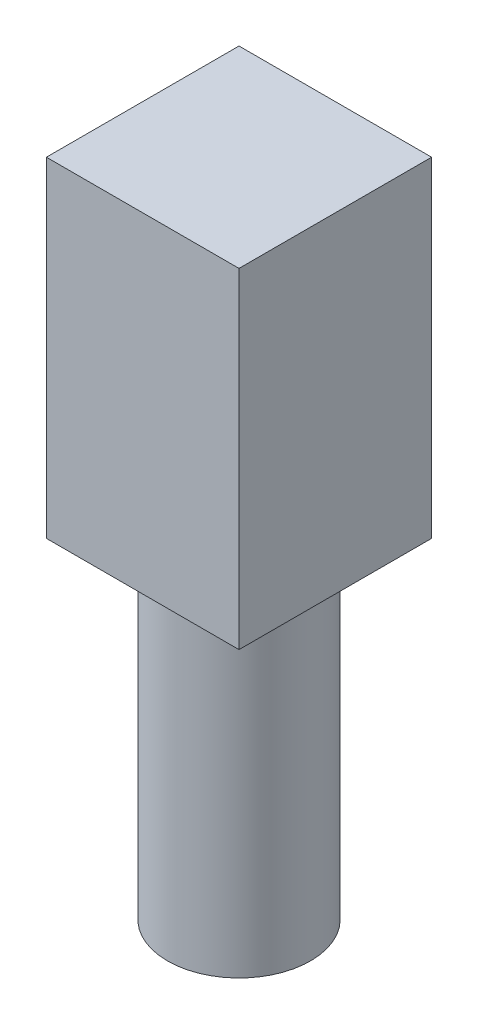
ISO-10303-21;
HEADER;
FILE_DESCRIPTION(('STEP AP214'),'2;1');
FILE_NAME('part.step','',(''),(''),'','','');
FILE_SCHEMA(('AUTOMOTIVE_DESIGN { 1 0 10303 214 1 1 1 1 }'));
ENDSEC;
DATA;
#1=APPLICATION_CONTEXT('core data for automotive mechanical design processes');
#2=APPLICATION_PROTOCOL_DEFINITION('international standard','automotive_design',2000,#1);
#3=PRODUCT_CONTEXT('',#1,'mechanical');
#4=PRODUCT('Part','Part','',(#3));
#5=PRODUCT_RELATED_PRODUCT_CATEGORY('part','',(#4));
#6=PRODUCT_DEFINITION_FORMATION('','',#4);
#7=PRODUCT_DEFINITION_CONTEXT('part definition',#1,'design');
#8=PRODUCT_DEFINITION('design','',#6,#7);
#9=PRODUCT_DEFINITION_SHAPE('','',#8);
#10=(LENGTH_UNIT() NAMED_UNIT(*) SI_UNIT(.MILLI.,.METRE.));
#11=(NAMED_UNIT(*) PLANE_ANGLE_UNIT() SI_UNIT($,.RADIAN.));
#12=(NAMED_UNIT(*) SI_UNIT($,.STERADIAN.) SOLID_ANGLE_UNIT());
#13=UNCERTAINTY_MEASURE_WITH_UNIT(LENGTH_MEASURE(1.E-05),#10,'distance_accuracy_value','');
#14=(GEOMETRIC_REPRESENTATION_CONTEXT(3) GLOBAL_UNCERTAINTY_ASSIGNED_CONTEXT((#13)) GLOBAL_UNIT_ASSIGNED_CONTEXT((#10,
#11,#12)) REPRESENTATION_CONTEXT('',''));
#15=CARTESIAN_POINT('',(0.,0.,0.));
#16=DIRECTION('',(0.,0.,1.));
#17=DIRECTION('',(1.,0.,0.));
#18=AXIS2_PLACEMENT_3D('',#15,#16,#17);
#19=CARTESIAN_POINT('',(0.,6.,0.));
#20=DIRECTION('',(0.,-1.,0.));
#21=DIRECTION('',(0.,0.,-1.));
#22=AXIS2_PLACEMENT_3D('',#19,#20,#21);
#23=CYLINDRICAL_SURFACE('',#22,1.3);
#24=CARTESIAN_POINT('',(0.,6.,0.));
#25=DIRECTION('',(0.,1.,0.));
#26=DIRECTION('',(0.,0.,1.));
#27=AXIS2_PLACEMENT_3D('',#24,#25,#26);
#28=CIRCLE('',#27,1.3);
#29=CARTESIAN_POINT('',(0.,6.,1.3));
#30=VERTEX_POINT('',#29);
#31=EDGE_CURVE('E11',#30,#30,#28,.T.);
#32=ORIENTED_EDGE('',*,*,#31,.F.);
#33=EDGE_LOOP('',(#32));
#34=FACE_BOUND('',#33,.T.);
#35=CARTESIAN_POINT('',(0.,0.,0.));
#36=DIRECTION('',(0.,1.,0.));
#37=DIRECTION('',(0.,0.,1.));
#38=AXIS2_PLACEMENT_3D('',#35,#36,#37);
#39=CIRCLE('',#38,1.3);
#40=CARTESIAN_POINT('',(0.,0.,1.3));
#41=VERTEX_POINT('',#40);
#42=EDGE_CURVE('E36',#41,#41,#39,.T.);
#43=ORIENTED_EDGE('',*,*,#42,.T.);
#44=EDGE_LOOP('',(#43));
#45=FACE_BOUND('',#44,.T.);
#46=ADVANCED_FACE('F33',(#34,#45),#23,.T.);
#47=CARTESIAN_POINT('',(0.,0.,0.));
#48=DIRECTION('',(0.,1.,0.));
#49=DIRECTION('',(0.,0.,1.));
#50=AXIS2_PLACEMENT_3D('',#47,#48,#49);
#51=PLANE('',#50);
#52=ORIENTED_EDGE('',*,*,#42,.F.);
#53=EDGE_LOOP('',(#52));
#54=FACE_BOUND('',#53,.T.);
#55=ADVANCED_FACE('F112',(#54),#51,.F.);
#56=CARTESIAN_POINT('',(-1.75,12.,-1.75));
#57=DIRECTION('',(1.,0.,0.));
#58=DIRECTION('',(0.,0.,-1.));
#59=AXIS2_PLACEMENT_3D('',#56,#57,#58);
#60=PLANE('',#59);
#61=DIRECTION('',(0.,0.,1.));
#62=VECTOR('',#61,1.);
#63=CARTESIAN_POINT('',(-1.75,6.,-1.75));
#64=LINE('',#63,#62);
#65=CARTESIAN_POINT('',(-1.75,6.,-1.75));
#66=VERTEX_POINT('',#65);
#67=CARTESIAN_POINT('',(-1.75,6.,1.75));
#68=VERTEX_POINT('',#67);
#69=EDGE_CURVE('E100',#66,#68,#64,.T.);
#70=ORIENTED_EDGE('',*,*,#69,.T.);
#71=DIRECTION('',(0.,-1.,0.));
#72=VECTOR('',#71,1.);
#73=CARTESIAN_POINT('',(-1.75,12.,1.75));
#74=LINE('',#73,#72);
#75=CARTESIAN_POINT('',(-1.75,12.,1.75));
#76=VERTEX_POINT('',#75);
#77=EDGE_CURVE('E91',#76,#68,#74,.T.);
#78=ORIENTED_EDGE('',*,*,#77,.F.);
#79=DIRECTION('',(0.,0.,1.));
#80=VECTOR('',#79,1.);
#81=CARTESIAN_POINT('',(-1.75,12.,-1.75));
#82=LINE('',#81,#80);
#83=CARTESIAN_POINT('',(-1.75,12.,-1.75));
#84=VERTEX_POINT('',#83);
#85=EDGE_CURVE('E85',#84,#76,#82,.T.);
#86=ORIENTED_EDGE('',*,*,#85,.F.);
#87=DIRECTION('',(0.,-1.,0.));
#88=VECTOR('',#87,1.);
#89=CARTESIAN_POINT('',(-1.75,12.,-1.75));
#90=LINE('',#89,#88);
#91=EDGE_CURVE('E96',#84,#66,#90,.T.);
#92=ORIENTED_EDGE('',*,*,#91,.T.);
#93=EDGE_LOOP('',(#70,#78,#86,#92));
#94=FACE_BOUND('',#93,.T.);
#95=ADVANCED_FACE('F114',(#94),#60,.F.);
#96=CARTESIAN_POINT('',(1.75,12.,1.75));
#97=DIRECTION('',(0.,0.,-1.));
#98=DIRECTION('',(-1.,0.,0.));
#99=AXIS2_PLACEMENT_3D('',#96,#97,#98);
#100=PLANE('',#99);
#101=DIRECTION('',(1.,0.,0.));
#102=VECTOR('',#101,1.);
#103=CARTESIAN_POINT('',(1.75,6.,1.75));
#104=LINE('',#103,#102);
#105=CARTESIAN_POINT('',(1.75,6.,1.75));
#106=VERTEX_POINT('',#105);
#107=EDGE_CURVE('E90',#68,#106,#104,.T.);
#108=ORIENTED_EDGE('',*,*,#107,.T.);
#109=DIRECTION('',(0.,-1.,0.));
#110=VECTOR('',#109,1.);
#111=CARTESIAN_POINT('',(1.75,12.,1.75));
#112=LINE('',#111,#110);
#113=CARTESIAN_POINT('',(1.75,12.,1.75));
#114=VERTEX_POINT('',#113);
#115=EDGE_CURVE('E88',#114,#106,#112,.T.);
#116=ORIENTED_EDGE('',*,*,#115,.F.);
#117=DIRECTION('',(1.,0.,0.));
#118=VECTOR('',#117,1.);
#119=CARTESIAN_POINT('',(1.75,12.,1.75));
#120=LINE('',#119,#118);
#121=EDGE_CURVE('E80',#76,#114,#120,.T.);
#122=ORIENTED_EDGE('',*,*,#121,.F.);
#123=ORIENTED_EDGE('',*,*,#77,.T.);
#124=EDGE_LOOP('',(#108,#116,#122,#123));
#125=FACE_BOUND('',#124,.T.);
#126=ADVANCED_FACE('F89',(#125),#100,.F.);
#127=CARTESIAN_POINT('',(1.75,12.,-1.75));
#128=DIRECTION('',(-1.,0.,0.));
#129=DIRECTION('',(0.,0.,1.));
#130=AXIS2_PLACEMENT_3D('',#127,#128,#129);
#131=PLANE('',#130);
#132=DIRECTION('',(0.,0.,-1.));
#133=VECTOR('',#132,1.);
#134=CARTESIAN_POINT('',(1.75,6.,-1.75));
#135=LINE('',#134,#133);
#136=CARTESIAN_POINT('',(1.75,6.,-1.75));
#137=VERTEX_POINT('',#136);
#138=EDGE_CURVE('E66',#106,#137,#135,.T.);
#139=ORIENTED_EDGE('',*,*,#138,.T.);
#140=DIRECTION('',(0.,-1.,0.));
#141=VECTOR('',#140,1.);
#142=CARTESIAN_POINT('',(1.75,12.,-1.75));
#143=LINE('',#142,#141);
#144=CARTESIAN_POINT('',(1.75,12.,-1.75));
#145=VERTEX_POINT('',#144);
#146=EDGE_CURVE('E92',#145,#137,#143,.T.);
#147=ORIENTED_EDGE('',*,*,#146,.F.);
#148=DIRECTION('',(0.,0.,-1.));
#149=VECTOR('',#148,1.);
#150=CARTESIAN_POINT('',(1.75,12.,-1.75));
#151=LINE('',#150,#149);
#152=EDGE_CURVE('E83',#114,#145,#151,.T.);
#153=ORIENTED_EDGE('',*,*,#152,.F.);
#154=ORIENTED_EDGE('',*,*,#115,.T.);
#155=EDGE_LOOP('',(#139,#147,#153,#154));
#156=FACE_BOUND('',#155,.T.);
#157=ADVANCED_FACE('F94',(#156),#131,.F.);
#158=CARTESIAN_POINT('',(1.75,12.,-1.75));
#159=DIRECTION('',(0.,0.,1.));
#160=DIRECTION('',(1.,0.,0.));
#161=AXIS2_PLACEMENT_3D('',#158,#159,#160);
#162=PLANE('',#161);
#163=DIRECTION('',(-1.,0.,0.));
#164=VECTOR('',#163,1.);
#165=CARTESIAN_POINT('',(1.75,6.,-1.75));
#166=LINE('',#165,#164);
#167=EDGE_CURVE('E72',#137,#66,#166,.T.);
#168=ORIENTED_EDGE('',*,*,#167,.T.);
#169=ORIENTED_EDGE('',*,*,#91,.F.);
#170=DIRECTION('',(-1.,0.,0.));
#171=VECTOR('',#170,1.);
#172=CARTESIAN_POINT('',(1.75,12.,-1.75));
#173=LINE('',#172,#171);
#174=EDGE_CURVE('E49',#145,#84,#173,.T.);
#175=ORIENTED_EDGE('',*,*,#174,.F.);
#176=ORIENTED_EDGE('',*,*,#146,.T.);
#177=EDGE_LOOP('',(#168,#169,#175,#176));
#178=FACE_BOUND('',#177,.T.);
#179=ADVANCED_FACE('F127',(#178),#162,.F.);
#180=CARTESIAN_POINT('',(0.,12.,0.));
#181=DIRECTION('',(0.,-1.,0.));
#182=DIRECTION('',(0.,0.,-1.));
#183=AXIS2_PLACEMENT_3D('',#180,#181,#182);
#184=PLANE('',#183);
#185=ORIENTED_EDGE('',*,*,#85,.T.);
#186=ORIENTED_EDGE('',*,*,#121,.T.);
#187=ORIENTED_EDGE('',*,*,#152,.T.);
#188=ORIENTED_EDGE('',*,*,#174,.T.);
#189=EDGE_LOOP('',(#185,#186,#187,#188));
#190=FACE_BOUND('',#189,.T.);
#191=ADVANCED_FACE('F81',(#190),#184,.F.);
#192=CARTESIAN_POINT('',(0.,6.,0.));
#193=DIRECTION('',(0.,-1.,0.));
#194=DIRECTION('',(0.,0.,-1.));
#195=AXIS2_PLACEMENT_3D('',#192,#193,#194);
#196=PLANE('',#195);
#197=ORIENTED_EDGE('',*,*,#31,.T.);
#198=EDGE_LOOP('',(#197));
#199=FACE_BOUND('',#198,.T.);
#200=ORIENTED_EDGE('',*,*,#69,.F.);
#201=ORIENTED_EDGE('',*,*,#167,.F.);
#202=ORIENTED_EDGE('',*,*,#138,.F.);
#203=ORIENTED_EDGE('',*,*,#107,.F.);
#204=EDGE_LOOP('',(#200,#201,#202,#203));
#205=FACE_BOUND('',#204,.T.);
#206=ADVANCED_FACE('F130',(#199,#205),#196,.T.);
#207=CLOSED_SHELL('',(#46,#55,#95,#126,#157,#179,#191,#206));
#208=MANIFOLD_SOLID_BREP('B2',#207);
#209=ADVANCED_BREP_SHAPE_REPRESENTATION('',(#18,#208),#14);
#210=SHAPE_DEFINITION_REPRESENTATION(#9,#209);
ENDSEC;
END-ISO-10303-21;
